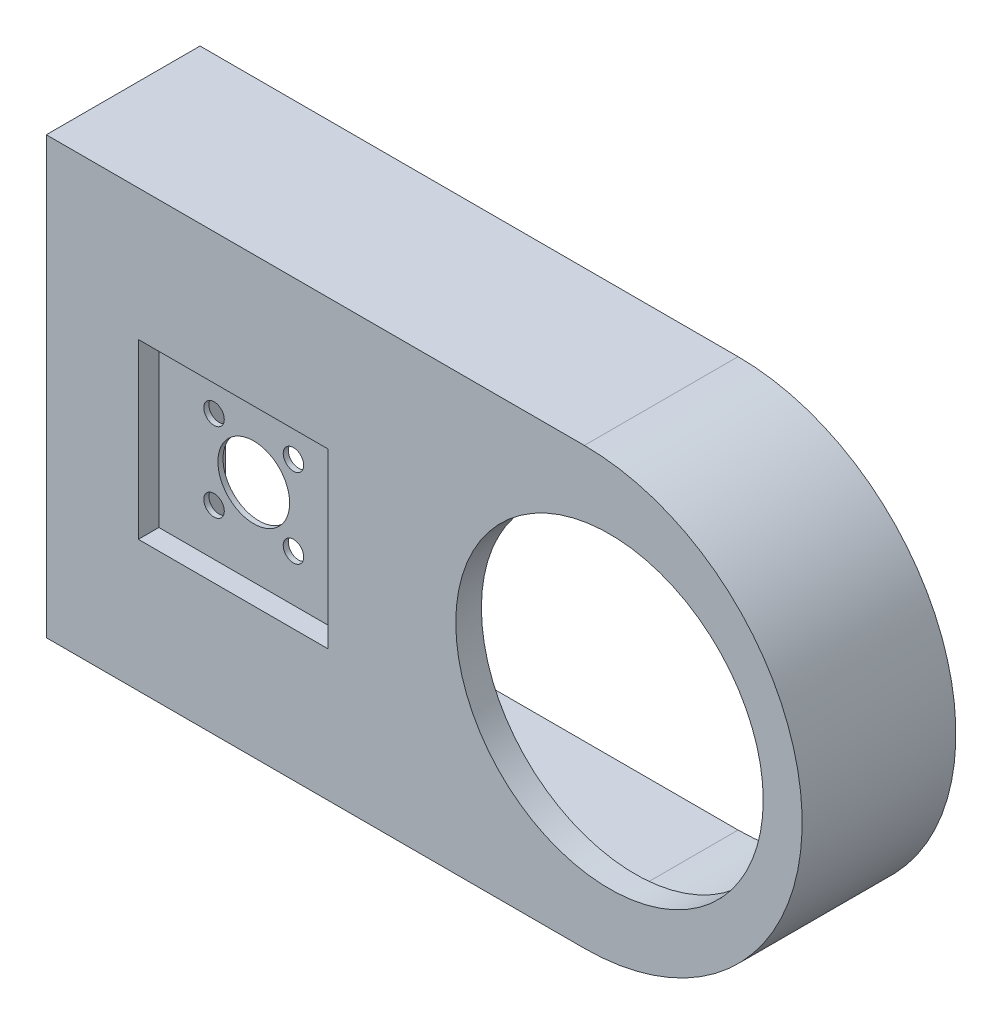
ISO-10303-21;
HEADER;
FILE_DESCRIPTION(('STEP AP214'),'2;1');
FILE_NAME('part.step','',(''),(''),'','','');
FILE_SCHEMA(('AUTOMOTIVE_DESIGN { 1 0 10303 214 1 1 1 1 }'));
ENDSEC;
DATA;
#1=APPLICATION_CONTEXT('core data for automotive mechanical design processes');
#2=APPLICATION_PROTOCOL_DEFINITION('international standard','automotive_design',2000,#1);
#3=PRODUCT_CONTEXT('',#1,'mechanical');
#4=PRODUCT('Part','Part','',(#3));
#5=PRODUCT_RELATED_PRODUCT_CATEGORY('part','',(#4));
#6=PRODUCT_DEFINITION_FORMATION('','',#4);
#7=PRODUCT_DEFINITION_CONTEXT('part definition',#1,'design');
#8=PRODUCT_DEFINITION('design','',#6,#7);
#9=PRODUCT_DEFINITION_SHAPE('','',#8);
#10=(LENGTH_UNIT() NAMED_UNIT(*) SI_UNIT(.MILLI.,.METRE.));
#11=(NAMED_UNIT(*) PLANE_ANGLE_UNIT() SI_UNIT($,.RADIAN.));
#12=(NAMED_UNIT(*) SI_UNIT($,.STERADIAN.) SOLID_ANGLE_UNIT());
#13=UNCERTAINTY_MEASURE_WITH_UNIT(LENGTH_MEASURE(1.E-05),#10,'distance_accuracy_value','');
#14=(GEOMETRIC_REPRESENTATION_CONTEXT(3) GLOBAL_UNCERTAINTY_ASSIGNED_CONTEXT((#13)) GLOBAL_UNIT_ASSIGNED_CONTEXT((#10,
#11,#12)) REPRESENTATION_CONTEXT('',''));
#15=CARTESIAN_POINT('',(0.,0.,0.));
#16=DIRECTION('',(0.,0.,1.));
#17=DIRECTION('',(1.,0.,0.));
#18=AXIS2_PLACEMENT_3D('',#15,#16,#17);
#19=CARTESIAN_POINT('',(100.,0.,-60.));
#20=DIRECTION('',(0.,0.,1.));
#21=DIRECTION('',(1.,0.,0.));
#22=AXIS2_PLACEMENT_3D('',#19,#20,#21);
#23=CYLINDRICAL_SURFACE('',#22,75.);
#24=CARTESIAN_POINT('',(100.,0.,-10.));
#25=DIRECTION('',(0.,0.,1.));
#26=DIRECTION('',(1.,0.,0.));
#27=AXIS2_PLACEMENT_3D('',#24,#25,#26);
#28=CIRCLE('',#27,75.);
#29=CARTESIAN_POINT('',(100.,-75.,-10.));
#30=VERTEX_POINT('',#29);
#31=CARTESIAN_POINT('',(100.,75.,-10.));
#32=VERTEX_POINT('',#31);
#33=EDGE_CURVE('E193',#30,#32,#28,.T.);
#34=ORIENTED_EDGE('',*,*,#33,.T.);
#35=DIRECTION('',(0.,0.,1.));
#36=VECTOR('',#35,1.);
#37=CARTESIAN_POINT('',(100.,75.,-60.));
#38=LINE('',#37,#36);
#39=CARTESIAN_POINT('',(100.,75.,-60.));
#40=VERTEX_POINT('',#39);
#41=EDGE_CURVE('E215',#40,#32,#38,.T.);
#42=ORIENTED_EDGE('',*,*,#41,.F.);
#43=CARTESIAN_POINT('',(100.,0.,-60.));
#44=DIRECTION('',(0.,0.,1.));
#45=DIRECTION('',(1.,0.,0.));
#46=AXIS2_PLACEMENT_3D('',#43,#44,#45);
#47=CIRCLE('',#46,75.);
#48=CARTESIAN_POINT('',(100.,-75.,-60.));
#49=VERTEX_POINT('',#48);
#50=EDGE_CURVE('E203',#49,#40,#47,.T.);
#51=ORIENTED_EDGE('',*,*,#50,.F.);
#52=DIRECTION('',(0.,0.,1.));
#53=VECTOR('',#52,1.);
#54=CARTESIAN_POINT('',(100.,-75.,-60.));
#55=LINE('',#54,#53);
#56=EDGE_CURVE('E216',#49,#30,#55,.T.);
#57=ORIENTED_EDGE('',*,*,#56,.T.);
#58=EDGE_LOOP('',(#34,#42,#51,#57));
#59=FACE_BOUND('',#58,.T.);
#60=ADVANCED_FACE('F57',(#59),#23,.F.);
#61=CARTESIAN_POINT('',(-100.,-75.,-60.));
#62=DIRECTION('',(0.,-1.,0.));
#63=DIRECTION('',(0.,0.,-1.));
#64=AXIS2_PLACEMENT_3D('',#61,#62,#63);
#65=PLANE('',#64);
#66=DIRECTION('',(1.,0.,0.));
#67=VECTOR('',#66,1.);
#68=CARTESIAN_POINT('',(-100.,-75.,-10.));
#69=LINE('',#68,#67);
#70=CARTESIAN_POINT('',(-100.,-75.,-10.));
#71=VERTEX_POINT('',#70);
#72=EDGE_CURVE('E82',#71,#30,#69,.T.);
#73=ORIENTED_EDGE('',*,*,#72,.T.);
#74=ORIENTED_EDGE('',*,*,#56,.F.);
#75=DIRECTION('',(1.,0.,0.));
#76=VECTOR('',#75,1.);
#77=CARTESIAN_POINT('',(-100.,-75.,-60.));
#78=LINE('',#77,#76);
#79=CARTESIAN_POINT('',(-100.,-75.,-60.));
#80=VERTEX_POINT('',#79);
#81=EDGE_CURVE('E212',#80,#49,#78,.T.);
#82=ORIENTED_EDGE('',*,*,#81,.F.);
#83=DIRECTION('',(0.,0.,1.));
#84=VECTOR('',#83,1.);
#85=CARTESIAN_POINT('',(-100.,-75.,-60.));
#86=LINE('',#85,#84);
#87=EDGE_CURVE('E219',#80,#71,#86,.T.);
#88=ORIENTED_EDGE('',*,*,#87,.T.);
#89=EDGE_LOOP('',(#73,#74,#82,#88));
#90=FACE_BOUND('',#89,.T.);
#91=ADVANCED_FACE('F276',(#90),#65,.F.);
#92=CARTESIAN_POINT('',(-100.,-75.,-60.));
#93=DIRECTION('',(-1.,0.,0.));
#94=DIRECTION('',(0.,0.,1.));
#95=AXIS2_PLACEMENT_3D('',#92,#93,#94);
#96=PLANE('',#95);
#97=DIRECTION('',(0.,-1.,0.));
#98=VECTOR('',#97,1.);
#99=CARTESIAN_POINT('',(-100.,-75.,-10.));
#100=LINE('',#99,#98);
#101=CARTESIAN_POINT('',(-100.,75.,-10.));
#102=VERTEX_POINT('',#101);
#103=EDGE_CURVE('E200',#102,#71,#100,.T.);
#104=ORIENTED_EDGE('',*,*,#103,.T.);
#105=ORIENTED_EDGE('',*,*,#87,.F.);
#106=DIRECTION('',(0.,-1.,0.));
#107=VECTOR('',#106,1.);
#108=CARTESIAN_POINT('',(-100.,-75.,-60.));
#109=LINE('',#108,#107);
#110=CARTESIAN_POINT('',(-100.,75.,-60.));
#111=VERTEX_POINT('',#110);
#112=EDGE_CURVE('E209',#111,#80,#109,.T.);
#113=ORIENTED_EDGE('',*,*,#112,.F.);
#114=DIRECTION('',(0.,0.,1.));
#115=VECTOR('',#114,1.);
#116=CARTESIAN_POINT('',(-100.,75.,-60.));
#117=LINE('',#116,#115);
#118=EDGE_CURVE('E221',#111,#102,#117,.T.);
#119=ORIENTED_EDGE('',*,*,#118,.T.);
#120=EDGE_LOOP('',(#104,#105,#113,#119));
#121=FACE_BOUND('',#120,.T.);
#122=ADVANCED_FACE('F282',(#121),#96,.F.);
#123=CARTESIAN_POINT('',(-100.,75.,-60.));
#124=DIRECTION('',(0.,1.,0.));
#125=DIRECTION('',(0.,0.,1.));
#126=AXIS2_PLACEMENT_3D('',#123,#124,#125);
#127=PLANE('',#126);
#128=DIRECTION('',(-1.,0.,0.));
#129=VECTOR('',#128,1.);
#130=CARTESIAN_POINT('',(-100.,75.,-10.));
#131=LINE('',#130,#129);
#132=EDGE_CURVE('E198',#32,#102,#131,.T.);
#133=ORIENTED_EDGE('',*,*,#132,.T.);
#134=ORIENTED_EDGE('',*,*,#118,.F.);
#135=DIRECTION('',(-1.,0.,0.));
#136=VECTOR('',#135,1.);
#137=CARTESIAN_POINT('',(-100.,75.,-60.));
#138=LINE('',#137,#136);
#139=EDGE_CURVE('E206',#40,#111,#138,.T.);
#140=ORIENTED_EDGE('',*,*,#139,.F.);
#141=ORIENTED_EDGE('',*,*,#41,.T.);
#142=EDGE_LOOP('',(#133,#134,#140,#141));
#143=FACE_BOUND('',#142,.T.);
#144=ADVANCED_FACE('F286',(#143),#127,.F.);
#145=CARTESIAN_POINT('',(100.,0.,-60.));
#146=DIRECTION('',(0.,0.,1.));
#147=DIRECTION('',(1.,0.,0.));
#148=AXIS2_PLACEMENT_3D('',#145,#146,#147);
#149=CYLINDRICAL_SURFACE('',#148,85.);
#150=CARTESIAN_POINT('',(100.,0.,0.));
#151=DIRECTION('',(0.,0.,1.));
#152=DIRECTION('',(1.,0.,0.));
#153=AXIS2_PLACEMENT_3D('',#150,#151,#152);
#154=CIRCLE('',#153,85.);
#155=CARTESIAN_POINT('',(100.,-85.,0.));
#156=VERTEX_POINT('',#155);
#157=CARTESIAN_POINT('',(100.,85.,0.));
#158=VERTEX_POINT('',#157);
#159=EDGE_CURVE('E218',#156,#158,#154,.T.);
#160=ORIENTED_EDGE('',*,*,#159,.F.);
#161=DIRECTION('',(0.,0.,1.));
#162=VECTOR('',#161,1.);
#163=CARTESIAN_POINT('',(100.,-85.,-60.));
#164=LINE('',#163,#162);
#165=CARTESIAN_POINT('',(100.,-85.,-60.));
#166=VERTEX_POINT('',#165);
#167=EDGE_CURVE('E12',#166,#156,#164,.T.);
#168=ORIENTED_EDGE('',*,*,#167,.F.);
#169=CARTESIAN_POINT('',(100.,0.,-60.));
#170=DIRECTION('',(0.,0.,1.));
#171=DIRECTION('',(1.,0.,0.));
#172=AXIS2_PLACEMENT_3D('',#169,#170,#171);
#173=CIRCLE('',#172,85.);
#174=CARTESIAN_POINT('',(100.,85.,-60.));
#175=VERTEX_POINT('',#174);
#176=EDGE_CURVE('E225',#166,#175,#173,.T.);
#177=ORIENTED_EDGE('',*,*,#176,.T.);
#178=DIRECTION('',(0.,0.,1.));
#179=VECTOR('',#178,1.);
#180=CARTESIAN_POINT('',(100.,85.,-60.));
#181=LINE('',#180,#179);
#182=EDGE_CURVE('E61',#175,#158,#181,.T.);
#183=ORIENTED_EDGE('',*,*,#182,.T.);
#184=EDGE_LOOP('',(#160,#168,#177,#183));
#185=FACE_BOUND('',#184,.T.);
#186=ADVANCED_FACE('F59',(#185),#149,.T.);
#187=CARTESIAN_POINT('',(-100.,-85.,-60.));
#188=DIRECTION('',(0.,-1.,0.));
#189=DIRECTION('',(0.,0.,-1.));
#190=AXIS2_PLACEMENT_3D('',#187,#188,#189);
#191=PLANE('',#190);
#192=DIRECTION('',(1.,0.,0.));
#193=VECTOR('',#192,1.);
#194=CARTESIAN_POINT('',(-100.,-85.,0.));
#195=LINE('',#194,#193);
#196=CARTESIAN_POINT('',(-110.,-85.,0.));
#197=VERTEX_POINT('',#196);
#198=EDGE_CURVE('E229',#197,#156,#195,.T.);
#199=ORIENTED_EDGE('',*,*,#198,.F.);
#200=DIRECTION('',(0.,0.,1.));
#201=VECTOR('',#200,1.);
#202=CARTESIAN_POINT('',(-110.,-85.,-60.));
#203=LINE('',#202,#201);
#204=CARTESIAN_POINT('',(-110.,-85.,-60.));
#205=VERTEX_POINT('',#204);
#206=EDGE_CURVE('E66',#205,#197,#203,.T.);
#207=ORIENTED_EDGE('',*,*,#206,.F.);
#208=DIRECTION('',(1.,0.,0.));
#209=VECTOR('',#208,1.);
#210=CARTESIAN_POINT('',(-100.,-85.,-60.));
#211=LINE('',#210,#209);
#212=EDGE_CURVE('E235',#205,#166,#211,.T.);
#213=ORIENTED_EDGE('',*,*,#212,.T.);
#214=ORIENTED_EDGE('',*,*,#167,.T.);
#215=EDGE_LOOP('',(#199,#207,#213,#214));
#216=FACE_BOUND('',#215,.T.);
#217=ADVANCED_FACE('F261',(#216),#191,.T.);
#218=CARTESIAN_POINT('',(-110.,-75.,-60.));
#219=DIRECTION('',(-1.,0.,0.));
#220=DIRECTION('',(0.,0.,1.));
#221=AXIS2_PLACEMENT_3D('',#218,#219,#220);
#222=PLANE('',#221);
#223=DIRECTION('',(0.,-1.,0.));
#224=VECTOR('',#223,1.);
#225=CARTESIAN_POINT('',(-110.,-75.,0.));
#226=LINE('',#225,#224);
#227=CARTESIAN_POINT('',(-110.,85.,0.));
#228=VERTEX_POINT('',#227);
#229=EDGE_CURVE('E243',#228,#197,#226,.T.);
#230=ORIENTED_EDGE('',*,*,#229,.F.);
#231=DIRECTION('',(0.,0.,1.));
#232=VECTOR('',#231,1.);
#233=CARTESIAN_POINT('',(-110.,85.,-60.));
#234=LINE('',#233,#232);
#235=CARTESIAN_POINT('',(-110.,85.,-60.));
#236=VERTEX_POINT('',#235);
#237=EDGE_CURVE('E248',#236,#228,#234,.T.);
#238=ORIENTED_EDGE('',*,*,#237,.F.);
#239=DIRECTION('',(0.,-1.,0.));
#240=VECTOR('',#239,1.);
#241=CARTESIAN_POINT('',(-110.,-75.,-60.));
#242=LINE('',#241,#240);
#243=EDGE_CURVE('E232',#236,#205,#242,.T.);
#244=ORIENTED_EDGE('',*,*,#243,.T.);
#245=ORIENTED_EDGE('',*,*,#206,.T.);
#246=EDGE_LOOP('',(#230,#238,#244,#245));
#247=FACE_BOUND('',#246,.T.);
#248=ADVANCED_FACE('F267',(#247),#222,.T.);
#249=CARTESIAN_POINT('',(-100.,85.,-60.));
#250=DIRECTION('',(0.,1.,0.));
#251=DIRECTION('',(0.,0.,1.));
#252=AXIS2_PLACEMENT_3D('',#249,#250,#251);
#253=PLANE('',#252);
#254=DIRECTION('',(-1.,0.,0.));
#255=VECTOR('',#254,1.);
#256=CARTESIAN_POINT('',(-100.,85.,0.));
#257=LINE('',#256,#255);
#258=EDGE_CURVE('E240',#158,#228,#257,.T.);
#259=ORIENTED_EDGE('',*,*,#258,.F.);
#260=ORIENTED_EDGE('',*,*,#182,.F.);
#261=DIRECTION('',(-1.,0.,0.));
#262=VECTOR('',#261,1.);
#263=CARTESIAN_POINT('',(-100.,85.,-60.));
#264=LINE('',#263,#262);
#265=EDGE_CURVE('E228',#175,#236,#264,.T.);
#266=ORIENTED_EDGE('',*,*,#265,.T.);
#267=ORIENTED_EDGE('',*,*,#237,.T.);
#268=EDGE_LOOP('',(#259,#260,#266,#267));
#269=FACE_BOUND('',#268,.T.);
#270=ADVANCED_FACE('F256',(#269),#253,.T.);
#271=CARTESIAN_POINT('',(100.,0.,-60.));
#272=DIRECTION('',(0.,0.,1.));
#273=DIRECTION('',(1.,0.,0.));
#274=AXIS2_PLACEMENT_3D('',#271,#272,#273);
#275=PLANE('',#274);
#276=ORIENTED_EDGE('',*,*,#81,.T.);
#277=ORIENTED_EDGE('',*,*,#50,.T.);
#278=ORIENTED_EDGE('',*,*,#139,.T.);
#279=ORIENTED_EDGE('',*,*,#112,.T.);
#280=EDGE_LOOP('',(#276,#277,#278,#279));
#281=FACE_BOUND('',#280,.T.);
#282=ORIENTED_EDGE('',*,*,#176,.F.);
#283=ORIENTED_EDGE('',*,*,#212,.F.);
#284=ORIENTED_EDGE('',*,*,#243,.F.);
#285=ORIENTED_EDGE('',*,*,#265,.F.);
#286=EDGE_LOOP('',(#282,#283,#284,#285));
#287=FACE_BOUND('',#286,.T.);
#288=ADVANCED_FACE('F264',(#281,#287),#275,.F.);
#289=CARTESIAN_POINT('',(100.,0.,0.));
#290=DIRECTION('',(0.,0.,1.));
#291=DIRECTION('',(1.,0.,0.));
#292=AXIS2_PLACEMENT_3D('',#289,#290,#291);
#293=PLANE('',#292);
#294=DIRECTION('',(0.,1.,0.));
#295=VECTOR('',#294,1.);
#296=CARTESIAN_POINT('',(0.,-33.7773208553188,0.));
#297=LINE('',#296,#295);
#298=CARTESIAN_POINT('',(0.,-33.7773208553188,0.));
#299=VERTEX_POINT('',#298);
#300=CARTESIAN_POINT('',(0.,33.7773208553188,0.));
#301=VERTEX_POINT('',#300);
#302=EDGE_CURVE('E74',#299,#301,#297,.T.);
#303=ORIENTED_EDGE('',*,*,#302,.F.);
#304=DIRECTION('',(1.,0.,0.));
#305=VECTOR('',#304,1.);
#306=CARTESIAN_POINT('',(-74.0642328826263,-33.7773208553188,0.));
#307=LINE('',#306,#305);
#308=CARTESIAN_POINT('',(-74.0642328826263,-33.7773208553188,0.));
#309=VERTEX_POINT('',#308);
#310=EDGE_CURVE('E168',#309,#299,#307,.T.);
#311=ORIENTED_EDGE('',*,*,#310,.F.);
#312=DIRECTION('',(0.,-1.,0.));
#313=VECTOR('',#312,1.);
#314=CARTESIAN_POINT('',(-74.0642328826263,-33.7773208553188,0.));
#315=LINE('',#314,#313);
#316=CARTESIAN_POINT('',(-74.0642328826263,33.7773208553188,0.));
#317=VERTEX_POINT('',#316);
#318=EDGE_CURVE('E171',#317,#309,#315,.T.);
#319=ORIENTED_EDGE('',*,*,#318,.F.);
#320=DIRECTION('',(-1.,0.,0.));
#321=VECTOR('',#320,1.);
#322=CARTESIAN_POINT('',(-74.0642328826263,33.7773208553188,0.));
#323=LINE('',#322,#321);
#324=EDGE_CURVE('E180',#301,#317,#323,.T.);
#325=ORIENTED_EDGE('',*,*,#324,.F.);
#326=EDGE_LOOP('',(#303,#311,#319,#325));
#327=FACE_BOUND('',#326,.T.);
#328=CARTESIAN_POINT('',(109.812010845189,0.,0.));
#329=DIRECTION('',(0.,0.,-1.));
#330=DIRECTION('',(-1.,0.,0.));
#331=AXIS2_PLACEMENT_3D('',#328,#329,#330);
#332=CIRCLE('',#331,60.);
#333=CARTESIAN_POINT('',(49.8120108451889,0.,0.));
#334=VERTEX_POINT('',#333);
#335=EDGE_CURVE('E190',#334,#334,#332,.T.);
#336=ORIENTED_EDGE('',*,*,#335,.T.);
#337=EDGE_LOOP('',(#336));
#338=FACE_BOUND('',#337,.T.);
#339=ORIENTED_EDGE('',*,*,#159,.T.);
#340=ORIENTED_EDGE('',*,*,#258,.T.);
#341=ORIENTED_EDGE('',*,*,#229,.T.);
#342=ORIENTED_EDGE('',*,*,#198,.T.);
#343=EDGE_LOOP('',(#339,#340,#341,#342));
#344=FACE_BOUND('',#343,.T.);
#345=ADVANCED_FACE('F258',(#327,#338,#344),#293,.T.);
#346=CARTESIAN_POINT('',(100.,0.,-10.));
#347=DIRECTION('',(0.,0.,1.));
#348=DIRECTION('',(1.,0.,0.));
#349=AXIS2_PLACEMENT_3D('',#346,#347,#348);
#350=PLANE('',#349);
#351=CARTESIAN_POINT('',(-52.5321164413132,-15.5,-10.));
#352=DIRECTION('',(0.,0.,1.));
#353=DIRECTION('',(1.,0.,0.));
#354=AXIS2_PLACEMENT_3D('',#351,#352,#353);
#355=CIRCLE('',#354,4.00000000000001);
#356=CARTESIAN_POINT('',(-48.5321164413131,-15.5,-10.));
#357=VERTEX_POINT('',#356);
#358=EDGE_CURVE('E375',#357,#357,#355,.T.);
#359=ORIENTED_EDGE('',*,*,#358,.T.);
#360=EDGE_LOOP('',(#359));
#361=FACE_BOUND('',#360,.T.);
#362=CARTESIAN_POINT('',(-21.5321164413132,-15.5,-10.));
#363=DIRECTION('',(0.,0.,1.));
#364=DIRECTION('',(1.,0.,0.));
#365=AXIS2_PLACEMENT_3D('',#362,#363,#364);
#366=CIRCLE('',#365,4.00000000000001);
#367=CARTESIAN_POINT('',(-17.5321164413132,-15.5,-10.));
#368=VERTEX_POINT('',#367);
#369=EDGE_CURVE('E371',#368,#368,#366,.T.);
#370=ORIENTED_EDGE('',*,*,#369,.T.);
#371=EDGE_LOOP('',(#370));
#372=FACE_BOUND('',#371,.T.);
#373=CARTESIAN_POINT('',(-21.5321164413132,15.5,-10.));
#374=DIRECTION('',(0.,0.,1.));
#375=DIRECTION('',(1.,0.,0.));
#376=AXIS2_PLACEMENT_3D('',#373,#374,#375);
#377=CIRCLE('',#376,4.00000000000001);
#378=CARTESIAN_POINT('',(-17.5321164413132,15.5,-10.));
#379=VERTEX_POINT('',#378);
#380=EDGE_CURVE('E369',#379,#379,#377,.T.);
#381=ORIENTED_EDGE('',*,*,#380,.T.);
#382=EDGE_LOOP('',(#381));
#383=FACE_BOUND('',#382,.T.);
#384=CARTESIAN_POINT('',(-52.5321164413132,15.5,-10.));
#385=DIRECTION('',(0.,0.,1.));
#386=DIRECTION('',(1.,0.,0.));
#387=AXIS2_PLACEMENT_3D('',#384,#385,#386);
#388=CIRCLE('',#387,4.00000000000001);
#389=CARTESIAN_POINT('',(-48.5321164413131,15.5,-10.));
#390=VERTEX_POINT('',#389);
#391=EDGE_CURVE('E372',#390,#390,#388,.T.);
#392=ORIENTED_EDGE('',*,*,#391,.T.);
#393=EDGE_LOOP('',(#392));
#394=FACE_BOUND('',#393,.T.);
#395=CARTESIAN_POINT('',(-37.0321164413132,0.,-10.));
#396=DIRECTION('',(0.,0.,1.));
#397=DIRECTION('',(1.,0.,0.));
#398=AXIS2_PLACEMENT_3D('',#395,#396,#397);
#399=CIRCLE('',#398,14.);
#400=CARTESIAN_POINT('',(-23.0321164413132,0.,-10.));
#401=VERTEX_POINT('',#400);
#402=EDGE_CURVE('E174',#401,#401,#399,.T.);
#403=ORIENTED_EDGE('',*,*,#402,.T.);
#404=EDGE_LOOP('',(#403));
#405=FACE_BOUND('',#404,.T.);
#406=CARTESIAN_POINT('',(109.812010845189,0.,-10.));
#407=DIRECTION('',(0.,0.,-1.));
#408=DIRECTION('',(-1.,0.,0.));
#409=AXIS2_PLACEMENT_3D('',#406,#407,#408);
#410=CIRCLE('',#409,60.);
#411=CARTESIAN_POINT('',(49.8120108451889,0.,-10.));
#412=VERTEX_POINT('',#411);
#413=EDGE_CURVE('E186',#412,#412,#410,.T.);
#414=ORIENTED_EDGE('',*,*,#413,.F.);
#415=EDGE_LOOP('',(#414));
#416=FACE_BOUND('',#415,.T.);
#417=ORIENTED_EDGE('',*,*,#33,.F.);
#418=ORIENTED_EDGE('',*,*,#72,.F.);
#419=ORIENTED_EDGE('',*,*,#103,.F.);
#420=ORIENTED_EDGE('',*,*,#132,.F.);
#421=EDGE_LOOP('',(#417,#418,#419,#420));
#422=FACE_BOUND('',#421,.T.);
#423=ADVANCED_FACE('F292',(#361,#372,#383,#394,#405,#416,#422),#350,.F.);
#424=CARTESIAN_POINT('',(109.812010845189,0.,0.));
#425=DIRECTION('',(0.,0.,-1.));
#426=DIRECTION('',(-1.,0.,0.));
#427=AXIS2_PLACEMENT_3D('',#424,#425,#426);
#428=CYLINDRICAL_SURFACE('',#427,60.);
#429=ORIENTED_EDGE('',*,*,#335,.F.);
#430=EDGE_LOOP('',(#429));
#431=FACE_BOUND('',#430,.T.);
#432=ORIENTED_EDGE('',*,*,#413,.T.);
#433=EDGE_LOOP('',(#432));
#434=FACE_BOUND('',#433,.T.);
#435=ADVANCED_FACE('F297',(#431,#434),#428,.F.);
#436=CARTESIAN_POINT('',(0.,-33.7773208553188,-8.));
#437=DIRECTION('',(1.,0.,0.));
#438=DIRECTION('',(0.,0.,-1.));
#439=AXIS2_PLACEMENT_3D('',#436,#437,#438);
#440=PLANE('',#439);
#441=ORIENTED_EDGE('',*,*,#302,.T.);
#442=DIRECTION('',(0.,0.,1.));
#443=VECTOR('',#442,1.);
#444=CARTESIAN_POINT('',(0.,33.7773208553188,-8.));
#445=LINE('',#444,#443);
#446=CARTESIAN_POINT('',(0.,33.7773208553188,-8.));
#447=VERTEX_POINT('',#446);
#448=EDGE_CURVE('E146',#447,#301,#445,.T.);
#449=ORIENTED_EDGE('',*,*,#448,.F.);
#450=DIRECTION('',(0.,1.,0.));
#451=VECTOR('',#450,1.);
#452=CARTESIAN_POINT('',(0.,-33.7773208553188,-8.));
#453=LINE('',#452,#451);
#454=CARTESIAN_POINT('',(0.,-33.7773208553188,-8.));
#455=VERTEX_POINT('',#454);
#456=EDGE_CURVE('E150',#455,#447,#453,.T.);
#457=ORIENTED_EDGE('',*,*,#456,.F.);
#458=DIRECTION('',(0.,0.,1.));
#459=VECTOR('',#458,1.);
#460=CARTESIAN_POINT('',(0.,-33.7773208553188,-8.));
#461=LINE('',#460,#459);
#462=EDGE_CURVE('E184',#455,#299,#461,.T.);
#463=ORIENTED_EDGE('',*,*,#462,.T.);
#464=EDGE_LOOP('',(#441,#449,#457,#463));
#465=FACE_BOUND('',#464,.T.);
#466=ADVANCED_FACE('F148',(#465),#440,.F.);
#467=CARTESIAN_POINT('',(-74.0642328826263,-33.7773208553188,-8.));
#468=DIRECTION('',(0.,-1.,0.));
#469=DIRECTION('',(0.,0.,-1.));
#470=AXIS2_PLACEMENT_3D('',#467,#468,#469);
#471=PLANE('',#470);
#472=ORIENTED_EDGE('',*,*,#310,.T.);
#473=ORIENTED_EDGE('',*,*,#462,.F.);
#474=DIRECTION('',(1.,0.,0.));
#475=VECTOR('',#474,1.);
#476=CARTESIAN_POINT('',(-74.0642328826263,-33.7773208553188,-8.));
#477=LINE('',#476,#475);
#478=CARTESIAN_POINT('',(-74.0642328826263,-33.7773208553188,-8.));
#479=VERTEX_POINT('',#478);
#480=EDGE_CURVE('E156',#479,#455,#477,.T.);
#481=ORIENTED_EDGE('',*,*,#480,.F.);
#482=DIRECTION('',(0.,0.,1.));
#483=VECTOR('',#482,1.);
#484=CARTESIAN_POINT('',(-74.0642328826263,-33.7773208553188,-8.));
#485=LINE('',#484,#483);
#486=EDGE_CURVE('E187',#479,#309,#485,.T.);
#487=ORIENTED_EDGE('',*,*,#486,.T.);
#488=EDGE_LOOP('',(#472,#473,#481,#487));
#489=FACE_BOUND('',#488,.T.);
#490=ADVANCED_FACE('F329',(#489),#471,.F.);
#491=CARTESIAN_POINT('',(-74.0642328826263,-33.7773208553188,-8.));
#492=DIRECTION('',(-1.,0.,0.));
#493=DIRECTION('',(0.,0.,1.));
#494=AXIS2_PLACEMENT_3D('',#491,#492,#493);
#495=PLANE('',#494);
#496=ORIENTED_EDGE('',*,*,#318,.T.);
#497=ORIENTED_EDGE('',*,*,#486,.F.);
#498=DIRECTION('',(0.,-1.,0.));
#499=VECTOR('',#498,1.);
#500=CARTESIAN_POINT('',(-74.0642328826263,-33.7773208553188,-8.));
#501=LINE('',#500,#499);
#502=CARTESIAN_POINT('',(-74.0642328826263,33.7773208553188,-8.));
#503=VERTEX_POINT('',#502);
#504=EDGE_CURVE('E164',#503,#479,#501,.T.);
#505=ORIENTED_EDGE('',*,*,#504,.F.);
#506=DIRECTION('',(0.,0.,1.));
#507=VECTOR('',#506,1.);
#508=CARTESIAN_POINT('',(-74.0642328826263,33.7773208553188,-8.));
#509=LINE('',#508,#507);
#510=EDGE_CURVE('E155',#503,#317,#509,.T.);
#511=ORIENTED_EDGE('',*,*,#510,.T.);
#512=EDGE_LOOP('',(#496,#497,#505,#511));
#513=FACE_BOUND('',#512,.T.);
#514=ADVANCED_FACE('F332',(#513),#495,.F.);
#515=CARTESIAN_POINT('',(-74.0642328826263,33.7773208553188,-8.));
#516=DIRECTION('',(0.,1.,0.));
#517=DIRECTION('',(0.,0.,1.));
#518=AXIS2_PLACEMENT_3D('',#515,#516,#517);
#519=PLANE('',#518);
#520=ORIENTED_EDGE('',*,*,#324,.T.);
#521=ORIENTED_EDGE('',*,*,#510,.F.);
#522=DIRECTION('',(-1.,0.,0.));
#523=VECTOR('',#522,1.);
#524=CARTESIAN_POINT('',(-74.0642328826263,33.7773208553188,-8.));
#525=LINE('',#524,#523);
#526=EDGE_CURVE('E159',#447,#503,#525,.T.);
#527=ORIENTED_EDGE('',*,*,#526,.F.);
#528=ORIENTED_EDGE('',*,*,#448,.T.);
#529=EDGE_LOOP('',(#520,#521,#527,#528));
#530=FACE_BOUND('',#529,.T.);
#531=ADVANCED_FACE('F160',(#530),#519,.F.);
#532=CARTESIAN_POINT('',(0.,0.,-8.));
#533=DIRECTION('',(0.,0.,-1.));
#534=DIRECTION('',(-1.,0.,0.));
#535=AXIS2_PLACEMENT_3D('',#532,#533,#534);
#536=PLANE('',#535);
#537=CARTESIAN_POINT('',(-52.5321164413132,-15.5,-8.));
#538=DIRECTION('',(0.,0.,1.));
#539=DIRECTION('',(-1.,0.,0.));
#540=AXIS2_PLACEMENT_3D('',#537,#538,#539);
#541=CIRCLE('',#540,4.00000000000001);
#542=CARTESIAN_POINT('',(-56.5321164413132,-15.5,-8.));
#543=VERTEX_POINT('',#542);
#544=EDGE_CURVE('E401',#543,#543,#541,.T.);
#545=ORIENTED_EDGE('',*,*,#544,.F.);
#546=EDGE_LOOP('',(#545));
#547=FACE_BOUND('',#546,.T.);
#548=CARTESIAN_POINT('',(-21.5321164413132,-15.5,-8.));
#549=DIRECTION('',(0.,0.,1.));
#550=DIRECTION('',(1.,0.,0.));
#551=AXIS2_PLACEMENT_3D('',#548,#549,#550);
#552=CIRCLE('',#551,4.00000000000001);
#553=CARTESIAN_POINT('',(-17.5321164413132,-15.5,-8.));
#554=VERTEX_POINT('',#553);
#555=EDGE_CURVE('E404',#554,#554,#552,.T.);
#556=ORIENTED_EDGE('',*,*,#555,.F.);
#557=EDGE_LOOP('',(#556));
#558=FACE_BOUND('',#557,.T.);
#559=CARTESIAN_POINT('',(-21.5321164413132,15.5,-8.));
#560=DIRECTION('',(0.,0.,1.));
#561=DIRECTION('',(-1.,0.,0.));
#562=AXIS2_PLACEMENT_3D('',#559,#560,#561);
#563=CIRCLE('',#562,4.00000000000001);
#564=CARTESIAN_POINT('',(-25.5321164413132,15.5,-8.));
#565=VERTEX_POINT('',#564);
#566=EDGE_CURVE('E366',#565,#565,#563,.T.);
#567=ORIENTED_EDGE('',*,*,#566,.F.);
#568=EDGE_LOOP('',(#567));
#569=FACE_BOUND('',#568,.T.);
#570=CARTESIAN_POINT('',(-52.5321164413132,15.5,-8.));
#571=DIRECTION('',(0.,0.,1.));
#572=DIRECTION('',(1.,0.,0.));
#573=AXIS2_PLACEMENT_3D('',#570,#571,#572);
#574=CIRCLE('',#573,4.00000000000001);
#575=CARTESIAN_POINT('',(-48.5321164413131,15.5,-8.));
#576=VERTEX_POINT('',#575);
#577=EDGE_CURVE('E378',#576,#576,#574,.T.);
#578=ORIENTED_EDGE('',*,*,#577,.F.);
#579=EDGE_LOOP('',(#578));
#580=FACE_BOUND('',#579,.T.);
#581=CARTESIAN_POINT('',(-37.0321164413132,0.,-8.));
#582=DIRECTION('',(0.,0.,-1.));
#583=DIRECTION('',(-1.,0.,0.));
#584=AXIS2_PLACEMENT_3D('',#581,#582,#583);
#585=CIRCLE('',#584,14.);
#586=CARTESIAN_POINT('',(-23.0321164413132,0.,-7.99999999999999));
#587=VERTEX_POINT('',#586);
#588=EDGE_CURVE('E383',#587,#587,#585,.T.);
#589=ORIENTED_EDGE('',*,*,#588,.T.);
#590=EDGE_LOOP('',(#589));
#591=FACE_BOUND('',#590,.T.);
#592=ORIENTED_EDGE('',*,*,#456,.T.);
#593=ORIENTED_EDGE('',*,*,#526,.T.);
#594=ORIENTED_EDGE('',*,*,#504,.T.);
#595=ORIENTED_EDGE('',*,*,#480,.T.);
#596=EDGE_LOOP('',(#592,#593,#594,#595));
#597=FACE_BOUND('',#596,.T.);
#598=ADVANCED_FACE('F166',(#547,#558,#569,#580,#591,#597),#536,.F.);
#599=CARTESIAN_POINT('',(-37.0321164413132,0.,-60.));
#600=DIRECTION('',(0.,0.,1.));
#601=DIRECTION('',(1.,0.,0.));
#602=AXIS2_PLACEMENT_3D('',#599,#600,#601);
#603=CYLINDRICAL_SURFACE('',#602,14.);
#604=CARTESIAN_POINT('',(-23.0321164413132,0.,-7.99999999999999));
#605=CARTESIAN_POINT('',(-23.0321164413132,0.,-8.02083333333333));
#606=CARTESIAN_POINT('',(-23.0321164413132,0.,-8.04166666666666));
#607=CARTESIAN_POINT('',(-23.0321164413132,0.,-8.08333333333333));
#608=CARTESIAN_POINT('',(-23.0321164413132,0.,-8.10416666666666));
#609=CARTESIAN_POINT('',(-23.0321164413132,0.,-8.14583333333333));
#610=CARTESIAN_POINT('',(-23.0321164413132,0.,-8.16666666666666));
#611=CARTESIAN_POINT('',(-23.0321164413132,0.,-8.20833333333333));
#612=CARTESIAN_POINT('',(-23.0321164413132,0.,-8.22916666666666));
#613=CARTESIAN_POINT('',(-23.0321164413132,0.,-8.27083333333333));
#614=CARTESIAN_POINT('',(-23.0321164413132,0.,-8.29166666666666));
#615=CARTESIAN_POINT('',(-23.0321164413132,0.,-8.33333333333333));
#616=CARTESIAN_POINT('',(-23.0321164413132,0.,-8.35416666666666));
#617=CARTESIAN_POINT('',(-23.0321164413132,0.,-8.39583333333333));
#618=CARTESIAN_POINT('',(-23.0321164413132,0.,-8.41666666666666));
#619=CARTESIAN_POINT('',(-23.0321164413132,0.,-8.45833333333333));
#620=CARTESIAN_POINT('',(-23.0321164413132,0.,-8.47916666666666));
#621=CARTESIAN_POINT('',(-23.0321164413132,0.,-8.52083333333333));
#622=CARTESIAN_POINT('',(-23.0321164413132,0.,-8.54166666666666));
#623=CARTESIAN_POINT('',(-23.0321164413132,0.,-8.58333333333333));
#624=CARTESIAN_POINT('',(-23.0321164413132,0.,-8.60416666666667));
#625=CARTESIAN_POINT('',(-23.0321164413132,0.,-8.64583333333333));
#626=CARTESIAN_POINT('',(-23.0321164413132,0.,-8.66666666666667));
#627=CARTESIAN_POINT('',(-23.0321164413132,0.,-8.70833333333333));
#628=CARTESIAN_POINT('',(-23.0321164413132,0.,-8.72916666666667));
#629=CARTESIAN_POINT('',(-23.0321164413132,0.,-8.77083333333333));
#630=CARTESIAN_POINT('',(-23.0321164413132,0.,-8.79166666666667));
#631=CARTESIAN_POINT('',(-23.0321164413132,0.,-8.83333333333333));
#632=CARTESIAN_POINT('',(-23.0321164413132,0.,-8.85416666666667));
#633=CARTESIAN_POINT('',(-23.0321164413132,0.,-8.89583333333333));
#634=CARTESIAN_POINT('',(-23.0321164413132,0.,-8.91666666666667));
#635=CARTESIAN_POINT('',(-23.0321164413132,0.,-8.95833333333333));
#636=CARTESIAN_POINT('',(-23.0321164413132,0.,-8.97916666666667));
#637=CARTESIAN_POINT('',(-23.0321164413132,0.,-9.02083333333333));
#638=CARTESIAN_POINT('',(-23.0321164413132,0.,-9.04166666666667));
#639=CARTESIAN_POINT('',(-23.0321164413132,0.,-9.08333333333333));
#640=CARTESIAN_POINT('',(-23.0321164413132,0.,-9.10416666666667));
#641=CARTESIAN_POINT('',(-23.0321164413132,0.,-9.14583333333333));
#642=CARTESIAN_POINT('',(-23.0321164413132,0.,-9.16666666666667));
#643=CARTESIAN_POINT('',(-23.0321164413132,0.,-9.20833333333333));
#644=CARTESIAN_POINT('',(-23.0321164413132,0.,-9.22916666666667));
#645=CARTESIAN_POINT('',(-23.0321164413132,0.,-9.27083333333333));
#646=CARTESIAN_POINT('',(-23.0321164413132,0.,-9.29166666666667));
#647=CARTESIAN_POINT('',(-23.0321164413132,0.,-9.33333333333333));
#648=CARTESIAN_POINT('',(-23.0321164413132,0.,-9.35416666666667));
#649=CARTESIAN_POINT('',(-23.0321164413132,0.,-9.39583333333333));
#650=CARTESIAN_POINT('',(-23.0321164413132,0.,-9.41666666666667));
#651=CARTESIAN_POINT('',(-23.0321164413132,0.,-9.45833333333334));
#652=CARTESIAN_POINT('',(-23.0321164413132,0.,-9.47916666666667));
#653=CARTESIAN_POINT('',(-23.0321164413132,0.,-9.52083333333334));
#654=CARTESIAN_POINT('',(-23.0321164413132,0.,-9.54166666666667));
#655=CARTESIAN_POINT('',(-23.0321164413132,0.,-9.58333333333334));
#656=CARTESIAN_POINT('',(-23.0321164413132,0.,-9.60416666666667));
#657=CARTESIAN_POINT('',(-23.0321164413132,0.,-9.64583333333334));
#658=CARTESIAN_POINT('',(-23.0321164413132,0.,-9.66666666666667));
#659=CARTESIAN_POINT('',(-23.0321164413132,0.,-9.70833333333334));
#660=CARTESIAN_POINT('',(-23.0321164413132,0.,-9.72916666666668));
#661=CARTESIAN_POINT('',(-23.0321164413132,0.,-9.77083333333334));
#662=CARTESIAN_POINT('',(-23.0321164413132,0.,-9.79166666666668));
#663=CARTESIAN_POINT('',(-23.0321164413132,0.,-9.83333333333334));
#664=CARTESIAN_POINT('',(-23.0321164413132,0.,-9.85416666666668));
#665=CARTESIAN_POINT('',(-23.0321164413132,0.,-9.89583333333334));
#666=CARTESIAN_POINT('',(-23.0321164413132,0.,-9.91666666666668));
#667=CARTESIAN_POINT('',(-23.0321164413132,0.,-9.95833333333334));
#668=CARTESIAN_POINT('',(-23.0321164413132,0.,-9.97916666666668));
#669=CARTESIAN_POINT('',(-23.0321164413132,0.,-10.));
#670=B_SPLINE_CURVE_WITH_KNOTS('',3,(#604,#605,#606,#607,#608,#609,#610,#611,#612,#613,#614,
#615,#616,#617,#618,#619,#620,#621,#622,#623,#624,#625,#626,#627,#628,#629,#630,#631,#632,#633,
#634,#635,#636,#637,#638,#639,#640,#641,#642,#643,#644,#645,#646,#647,#648,#649,#650,#651,#652,
#653,#654,#655,#656,#657,#658,#659,#660,#661,#662,#663,#664,#665,#666,#667,#668,#669),
.UNSPECIFIED.,.F.,.F.,(4,2,2,2,2,2,2,2,2,2,2,2,2,2,2,2,2,2,2,2,2,2,2,2,2,2,2,2,2,2,2,2,4),(0.,
0.0625000000000001,0.125,0.1875,0.25,0.3125,0.375,0.4375,0.5,0.562500000000007,
0.625000000000008,0.687500000000008,0.750000000000008,0.812500000000008,0.875000000000008,
0.937500000000008,1.00000000000001,1.06250000000001,1.12500000000001,1.18750000000001,
1.25000000000001,1.31250000000001,1.37500000000001,1.43750000000001,1.50000000000002,
1.56250000000002,1.62500000000002,1.68750000000002,1.75000000000002,1.81250000000002,
1.87500000000002,1.93750000000002,2.00000000000002),.UNSPECIFIED.);
#671=EDGE_CURVE('BSEAM341',#587,#401,#670,.T.);
#672=ORIENTED_EDGE('',*,*,#588,.F.);
#673=ORIENTED_EDGE('',*,*,#402,.F.);
#674=ORIENTED_EDGE('',*,*,#671,.T.);
#675=ORIENTED_EDGE('',*,*,#671,.F.);
#676=EDGE_LOOP('',(#672,#674,#673,#675));
#677=FACE_BOUND('',#676,.T.);
#678=ADVANCED_FACE('F341',(#677),#603,.F.);
#679=CARTESIAN_POINT('',(-52.5321164413132,15.5,-60.));
#680=DIRECTION('',(0.,0.,1.));
#681=DIRECTION('',(1.,0.,0.));
#682=AXIS2_PLACEMENT_3D('',#679,#680,#681);
#683=CYLINDRICAL_SURFACE('',#682,4.00000000000001);
#684=ORIENTED_EDGE('',*,*,#577,.T.);
#685=EDGE_LOOP('',(#684));
#686=FACE_BOUND('',#685,.T.);
#687=ORIENTED_EDGE('',*,*,#391,.F.);
#688=EDGE_LOOP('',(#687));
#689=FACE_BOUND('',#688,.T.);
#690=ADVANCED_FACE('F345',(#686,#689),#683,.F.);
#691=CARTESIAN_POINT('',(-21.5321164413132,15.5,-60.));
#692=DIRECTION('',(0.,0.,1.));
#693=DIRECTION('',(1.,0.,0.));
#694=AXIS2_PLACEMENT_3D('',#691,#692,#693);
#695=CYLINDRICAL_SURFACE('',#694,4.00000000000001);
#696=ORIENTED_EDGE('',*,*,#566,.T.);
#697=EDGE_LOOP('',(#696));
#698=FACE_BOUND('',#697,.T.);
#699=ORIENTED_EDGE('',*,*,#380,.F.);
#700=EDGE_LOOP('',(#699));
#701=FACE_BOUND('',#700,.T.);
#702=ADVANCED_FACE('F349',(#698,#701),#695,.F.);
#703=CARTESIAN_POINT('',(-21.5321164413132,-15.5,-60.));
#704=DIRECTION('',(0.,0.,1.));
#705=DIRECTION('',(1.,0.,0.));
#706=AXIS2_PLACEMENT_3D('',#703,#704,#705);
#707=CYLINDRICAL_SURFACE('',#706,4.00000000000001);
#708=ORIENTED_EDGE('',*,*,#555,.T.);
#709=EDGE_LOOP('',(#708));
#710=FACE_BOUND('',#709,.T.);
#711=ORIENTED_EDGE('',*,*,#369,.F.);
#712=EDGE_LOOP('',(#711));
#713=FACE_BOUND('',#712,.T.);
#714=ADVANCED_FACE('F354',(#710,#713),#707,.F.);
#715=CARTESIAN_POINT('',(-52.5321164413132,-15.5,-60.));
#716=DIRECTION('',(0.,0.,1.));
#717=DIRECTION('',(1.,0.,0.));
#718=AXIS2_PLACEMENT_3D('',#715,#716,#717);
#719=CYLINDRICAL_SURFACE('',#718,4.00000000000001);
#720=ORIENTED_EDGE('',*,*,#544,.T.);
#721=EDGE_LOOP('',(#720));
#722=FACE_BOUND('',#721,.T.);
#723=ORIENTED_EDGE('',*,*,#358,.F.);
#724=EDGE_LOOP('',(#723));
#725=FACE_BOUND('',#724,.T.);
#726=ADVANCED_FACE('F351',(#722,#725),#719,.F.);
#727=CLOSED_SHELL('',(#60,#91,#122,#144,#186,#217,#248,#270,#288,#345,#423,#435,#466,#490,#514,
#531,#598,#678,#690,#702,#714,#726));
#728=MANIFOLD_SOLID_BREP('B2',#727);
#729=ADVANCED_BREP_SHAPE_REPRESENTATION('',(#18,#728),#14);
#730=SHAPE_DEFINITION_REPRESENTATION(#9,#729);
ENDSEC;
END-ISO-10303-21;
